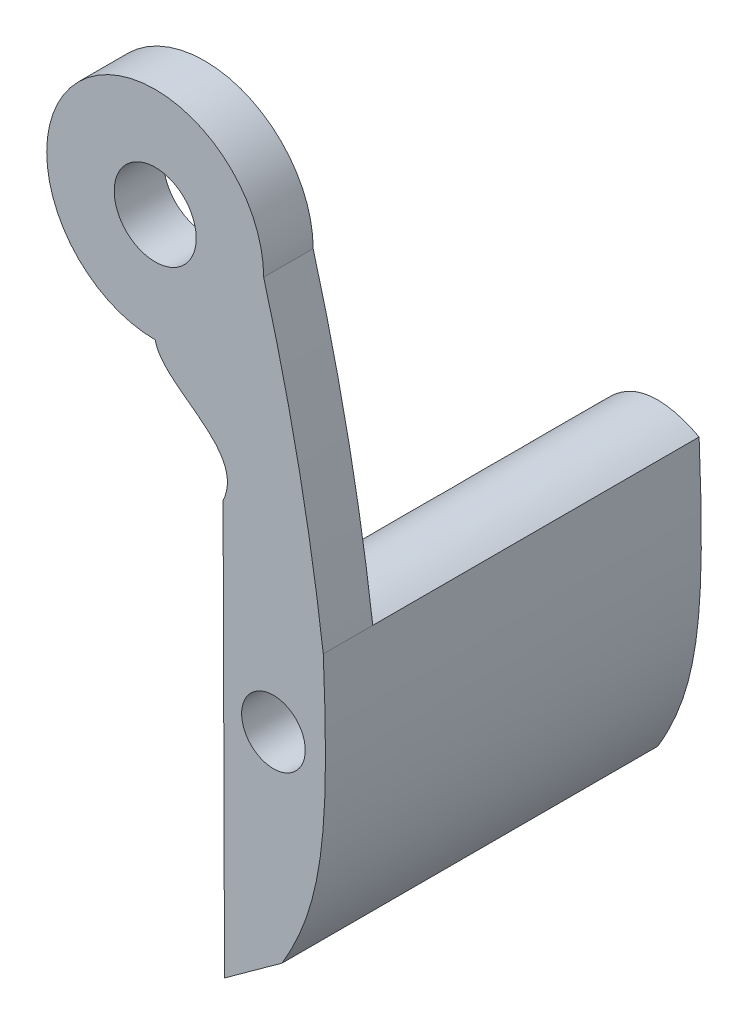
ISO-10303-21;
HEADER;
FILE_DESCRIPTION(('STEP AP214'),'2;1');
FILE_NAME('part.step','',(''),(''),'','','');
FILE_SCHEMA(('AUTOMOTIVE_DESIGN { 1 0 10303 214 1 1 1 1 }'));
ENDSEC;
DATA;
#1=APPLICATION_CONTEXT('core data for automotive mechanical design processes');
#2=APPLICATION_PROTOCOL_DEFINITION('international standard','automotive_design',2000,#1);
#3=PRODUCT_CONTEXT('',#1,'mechanical');
#4=PRODUCT('Part','Part','',(#3));
#5=PRODUCT_RELATED_PRODUCT_CATEGORY('part','',(#4));
#6=PRODUCT_DEFINITION_FORMATION('','',#4);
#7=PRODUCT_DEFINITION_CONTEXT('part definition',#1,'design');
#8=PRODUCT_DEFINITION('design','',#6,#7);
#9=PRODUCT_DEFINITION_SHAPE('','',#8);
#10=(LENGTH_UNIT() NAMED_UNIT(*) SI_UNIT(.MILLI.,.METRE.));
#11=(NAMED_UNIT(*) PLANE_ANGLE_UNIT() SI_UNIT($,.RADIAN.));
#12=(NAMED_UNIT(*) SI_UNIT($,.STERADIAN.) SOLID_ANGLE_UNIT());
#13=UNCERTAINTY_MEASURE_WITH_UNIT(LENGTH_MEASURE(1.E-05),#10,'distance_accuracy_value','');
#14=(GEOMETRIC_REPRESENTATION_CONTEXT(3) GLOBAL_UNCERTAINTY_ASSIGNED_CONTEXT((#13)) GLOBAL_UNIT_ASSIGNED_CONTEXT((#10,
#11,#12)) REPRESENTATION_CONTEXT('',''));
#15=CARTESIAN_POINT('',(0.,0.,0.));
#16=DIRECTION('',(0.,0.,1.));
#17=DIRECTION('',(1.,0.,0.));
#18=AXIS2_PLACEMENT_3D('',#15,#16,#17);
#19=CARTESIAN_POINT('',(23.5830831343586,-50.6621029570981,1.41873551586532));
#20=DIRECTION('',(-0.999993998212447,-0.00346461240021393,0.));
#21=DIRECTION('',(0.00346461240021393,-0.999993998212447,0.));
#22=AXIS2_PLACEMENT_3D('',#19,#20,#21);
#23=PLANE('',#22);
#24=DIRECTION('',(0.00346461240021393,-0.999993998212447,0.));
#25=VECTOR('',#24,1.);
#26=CARTESIAN_POINT('',(23.5830831343586,-50.6621029570981,4.91873551586532));
#27=LINE('',#26,#25);
#28=CARTESIAN_POINT('',(23.5830831343586,-50.6621029570981,4.91873551586532));
#29=VERTEX_POINT('',#28);
#30=CARTESIAN_POINT('',(23.6842225641709,-79.8540618581353,4.91873551586532));
#31=VERTEX_POINT('',#30);
#32=EDGE_CURVE('E143',#29,#31,#27,.T.);
#33=ORIENTED_EDGE('',*,*,#32,.F.);
#34=DIRECTION('',(0.,0.,1.));
#35=VECTOR('',#34,1.);
#36=CARTESIAN_POINT('',(23.5830831343586,-50.6621029570981,1.41873551586532));
#37=LINE('',#36,#35);
#38=CARTESIAN_POINT('',(23.5830831343586,-50.6621029570981,1.41873551586532));
#39=VERTEX_POINT('',#38);
#40=EDGE_CURVE('E11',#39,#29,#37,.T.);
#41=ORIENTED_EDGE('',*,*,#40,.F.);
#42=DIRECTION('',(0.00346461240020755,-0.999993998212447,0.));
#43=VECTOR('',#42,1.);
#44=CARTESIAN_POINT('',(23.6086615825674,-58.0448320297016,1.41873551586532));
#45=LINE('',#44,#43);
#46=CARTESIAN_POINT('',(23.6086615825711,-58.0448320307762,1.41873551586532));
#47=VERTEX_POINT('',#46);
#48=EDGE_CURVE('E59',#39,#47,#45,.T.);
#49=ORIENTED_EDGE('',*,*,#48,.T.);
#50=DIRECTION('',(0.,0.,1.));
#51=VECTOR('',#50,1.);
#52=CARTESIAN_POINT('',(23.6086615818498,-58.0448320307828,-21.6581314841347));
#53=LINE('',#52,#51);
#54=CARTESIAN_POINT('',(23.6086615818498,-58.0448320307828,-21.6581314841347));
#55=VERTEX_POINT('',#54);
#56=EDGE_CURVE('E112',#55,#47,#53,.T.);
#57=ORIENTED_EDGE('',*,*,#56,.F.);
#58=DIRECTION('',(-0.00346461240020755,0.999993998212447,0.));
#59=VECTOR('',#58,1.);
#60=CARTESIAN_POINT('',(23.6842225641709,-79.8540618581353,-21.6581314841347));
#61=LINE('',#60,#59);
#62=CARTESIAN_POINT('',(23.6842225641709,-79.8540618581353,-21.6581314841347));
#63=VERTEX_POINT('',#62);
#64=EDGE_CURVE('E119',#63,#55,#61,.T.);
#65=ORIENTED_EDGE('',*,*,#64,.F.);
#66=DIRECTION('',(0.,0.,1.));
#67=VECTOR('',#66,1.);
#68=CARTESIAN_POINT('',(23.6842225641709,-79.8540618581353,1.41873551586532));
#69=LINE('',#68,#67);
#70=EDGE_CURVE('E41',#63,#31,#69,.T.);
#71=ORIENTED_EDGE('',*,*,#70,.T.);
#72=EDGE_LOOP('',(#33,#41,#49,#57,#65,#71));
#73=FACE_BOUND('',#72,.T.);
#74=ADVANCED_FACE('F37',(#73),#23,.T.);
#75=CARTESIAN_POINT('',(18.7830331394305,-43.2252481779718,1.41873551586532));
#76=CARTESIAN_POINT('',(19.3227725840483,-45.8172283218555,1.41873551586532));
#77=CARTESIAN_POINT('',(25.294082338753,-46.9405897101704,1.41873551586532));
#78=CARTESIAN_POINT('',(23.5830831343586,-50.6621029570981,1.41873551586532));
#79=B_SPLINE_CURVE_WITH_KNOTS('',3,(#75,#76,#77,#78),.UNSPECIFIED.,.F.,.F.,(4,4),(0.,1.),.UNSPECIFIED.);
#80=DIRECTION('',(0.,0.,1.));
#81=VECTOR('',#80,1.);
#82=SURFACE_OF_LINEAR_EXTRUSION('',#79,#81);
#83=CARTESIAN_POINT('',(18.7830331394305,-43.2252481779718,4.91873551586532));
#84=CARTESIAN_POINT('',(19.3227725840483,-45.8172283218555,4.91873551586532));
#85=CARTESIAN_POINT('',(25.294082338753,-46.9405897101704,4.91873551586532));
#86=CARTESIAN_POINT('',(23.5830831343586,-50.6621029570981,4.91873551586532));
#87=B_SPLINE_CURVE_WITH_KNOTS('',3,(#83,#84,#85,#86),.UNSPECIFIED.,.F.,.F.,(4,4),(0.,1.),.UNSPECIFIED.);
#88=CARTESIAN_POINT('',(18.7830331394305,-43.2252481779718,4.91873551586532));
#89=VERTEX_POINT('',#88);
#90=EDGE_CURVE('E201',#89,#29,#87,.T.);
#91=ORIENTED_EDGE('',*,*,#90,.F.);
#92=DIRECTION('',(0.,0.,1.));
#93=VECTOR('',#92,1.);
#94=CARTESIAN_POINT('',(18.7830331394305,-43.2252481779718,1.41873551586532));
#95=LINE('',#94,#93);
#96=CARTESIAN_POINT('',(18.7830331394305,-43.2252481779718,1.41873551586532));
#97=VERTEX_POINT('',#96);
#98=EDGE_CURVE('E46',#97,#89,#95,.T.);
#99=ORIENTED_EDGE('',*,*,#98,.F.);
#100=EDGE_CURVE('E171',#97,#39,#79,.T.);
#101=ORIENTED_EDGE('',*,*,#100,.T.);
#102=ORIENTED_EDGE('',*,*,#40,.T.);
#103=EDGE_LOOP('',(#91,#99,#101,#102));
#104=FACE_BOUND('',#103,.T.);
#105=ADVANCED_FACE('F166',(#104),#82,.T.);
#106=CARTESIAN_POINT('',(18.7830331394305,-35.55478648582,1.41873551586532));
#107=DIRECTION('',(0.,0.,1.));
#108=DIRECTION('',(1.,0.,0.));
#109=AXIS2_PLACEMENT_3D('',#106,#107,#108);
#110=CYLINDRICAL_SURFACE('',#109,7.67046169215176);
#111=CARTESIAN_POINT('',(18.7830331394305,-35.55478648582,4.91873551586532));
#112=DIRECTION('',(0.,0.,1.));
#113=DIRECTION('',(1.,0.,0.));
#114=AXIS2_PLACEMENT_3D('',#111,#112,#113);
#115=CIRCLE('',#114,7.67046169215176);
#116=CARTESIAN_POINT('',(26.4534948315822,-35.55478648582,4.91873551586532));
#117=VERTEX_POINT('',#116);
#118=EDGE_CURVE('E195',#117,#89,#115,.T.);
#119=ORIENTED_EDGE('',*,*,#118,.F.);
#120=DIRECTION('',(0.,0.,1.));
#121=VECTOR('',#120,1.);
#122=CARTESIAN_POINT('',(26.4534948315822,-35.55478648582,1.41873551586532));
#123=LINE('',#122,#121);
#124=CARTESIAN_POINT('',(26.4534948315822,-35.55478648582,1.41873551586532));
#125=VERTEX_POINT('',#124);
#126=EDGE_CURVE('E90',#125,#117,#123,.T.);
#127=ORIENTED_EDGE('',*,*,#126,.F.);
#128=CARTESIAN_POINT('',(18.7830331394305,-35.55478648582,1.41873551586532));
#129=DIRECTION('',(0.,0.,1.));
#130=DIRECTION('',(1.,0.,0.));
#131=AXIS2_PLACEMENT_3D('',#128,#129,#130);
#132=CIRCLE('',#131,7.67046169215176);
#133=EDGE_CURVE('E176',#125,#97,#132,.T.);
#134=ORIENTED_EDGE('',*,*,#133,.T.);
#135=ORIENTED_EDGE('',*,*,#98,.T.);
#136=EDGE_LOOP('',(#119,#127,#134,#135));
#137=FACE_BOUND('',#136,.T.);
#138=ADVANCED_FACE('F162',(#137),#110,.T.);
#139=CARTESIAN_POINT('',(30.6680595779187,-56.5170898812196,1.41873551586532));
#140=CARTESIAN_POINT('',(29.3204289813708,-45.883744030394,1.41873551586532));
#141=CARTESIAN_POINT('',(26.4534948315822,-35.55478648582,1.41873551586532));
#142=B_SPLINE_CURVE_WITH_KNOTS('',2,(#139,#140,#141),.UNSPECIFIED.,.F.,.F.,(3,3),(0.,1.),.UNSPECIFIED.);
#143=DIRECTION('',(0.,0.,1.));
#144=VECTOR('',#143,1.);
#145=SURFACE_OF_LINEAR_EXTRUSION('',#142,#144);
#146=CARTESIAN_POINT('',(30.6680595779187,-56.5170898812196,4.91873551586532));
#147=CARTESIAN_POINT('',(29.3204289813708,-45.883744030394,4.91873551586532));
#148=CARTESIAN_POINT('',(26.4534948315822,-35.55478648582,4.91873551586532));
#149=B_SPLINE_CURVE_WITH_KNOTS('',2,(#146,#147,#148),.UNSPECIFIED.,.F.,.F.,(3,3),(0.,1.),.UNSPECIFIED.);
#150=CARTESIAN_POINT('',(30.6680595779187,-56.5170898812196,4.91873551586532));
#151=VERTEX_POINT('',#150);
#152=EDGE_CURVE('E187',#151,#117,#149,.T.);
#153=ORIENTED_EDGE('',*,*,#152,.F.);
#154=DIRECTION('',(0.,0.,1.));
#155=VECTOR('',#154,1.);
#156=CARTESIAN_POINT('',(30.6680595779187,-56.5170898812196,1.41873551586532));
#157=LINE('',#156,#155);
#158=CARTESIAN_POINT('',(30.668059577541,-56.5170898810181,1.41873551586532));
#159=VERTEX_POINT('',#158);
#160=EDGE_CURVE('E211',#159,#151,#157,.T.);
#161=ORIENTED_EDGE('',*,*,#160,.F.);
#162=EDGE_CURVE('E142',#159,#125,#142,.T.);
#163=ORIENTED_EDGE('',*,*,#162,.T.);
#164=ORIENTED_EDGE('',*,*,#126,.T.);
#165=EDGE_LOOP('',(#153,#161,#163,#164));
#166=FACE_BOUND('',#165,.T.);
#167=ADVANCED_FACE('F158',(#166),#145,.T.);
#168=CARTESIAN_POINT('',(27.7516650240297,-76.9116141942992,1.41873551586532));
#169=CARTESIAN_POINT('',(30.6656126513569,-71.9964375748199,1.41873551586532));
#170=CARTESIAN_POINT('',(31.1321794796414,-67.2565321556517,1.41873551586532));
#171=CARTESIAN_POINT('',(30.6680595779187,-56.5170898812196,1.41873551586532));
#172=B_SPLINE_CURVE_WITH_KNOTS('',3,(#168,#169,#170,#171),.UNSPECIFIED.,.F.,.F.,(4,4),
(0.222415534740242,0.766682964721302),.UNSPECIFIED.);
#173=DIRECTION('',(0.,0.,1.));
#174=VECTOR('',#173,1.);
#175=SURFACE_OF_LINEAR_EXTRUSION('',#172,#174);
#176=CARTESIAN_POINT('',(27.7516650240297,-76.9116141942992,4.91873551586532));
#177=CARTESIAN_POINT('',(30.6656126513569,-71.9964375748199,4.91873551586532));
#178=CARTESIAN_POINT('',(31.1321794796414,-67.2565321556517,4.91873551586532));
#179=CARTESIAN_POINT('',(30.6680595779187,-56.5170898812196,4.91873551586532));
#180=B_SPLINE_CURVE_WITH_KNOTS('',3,(#176,#177,#178,#179),.UNSPECIFIED.,.F.,.F.,(4,4),
(0.222415534740242,0.766682964721302),.UNSPECIFIED.);
#181=CARTESIAN_POINT('',(27.7516650240297,-76.9116141942992,4.91873551586532));
#182=VERTEX_POINT('',#181);
#183=EDGE_CURVE('E182',#182,#151,#180,.T.);
#184=ORIENTED_EDGE('',*,*,#183,.F.);
#185=DIRECTION('',(0.,0.,1.));
#186=VECTOR('',#185,1.);
#187=CARTESIAN_POINT('',(27.7516650240297,-76.9116141942992,1.41873551586532));
#188=LINE('',#187,#186);
#189=CARTESIAN_POINT('',(27.7516650240297,-76.9116141942992,-21.6581314841347));
#190=VERTEX_POINT('',#189);
#191=EDGE_CURVE('E212',#190,#182,#188,.T.);
#192=ORIENTED_EDGE('',*,*,#191,.F.);
#193=CARTESIAN_POINT('',(30.668059577541,-56.5170898810181,-21.6581314841347));
#194=CARTESIAN_POINT('',(31.1321794794735,-67.2565321554411,-21.6581314841347));
#195=CARTESIAN_POINT('',(30.6656126512816,-71.9964375746184,-21.6581314841347));
#196=CARTESIAN_POINT('',(27.7516650240504,-76.9116141941546,-21.6581314841347));
#197=B_SPLINE_CURVE_WITH_KNOTS('',3,(#193,#194,#195,#196),.UNSPECIFIED.,.F.,.F.,(4,4),
(0.222415534740242,0.766682964721302),.UNSPECIFIED.);
#198=CARTESIAN_POINT('',(30.668059577541,-56.5170898810181,-21.6581314841347));
#199=VERTEX_POINT('',#198);
#200=EDGE_CURVE('E118',#199,#190,#197,.T.);
#201=ORIENTED_EDGE('',*,*,#200,.F.);
#202=DIRECTION('',(0.,0.,1.));
#203=VECTOR('',#202,1.);
#204=CARTESIAN_POINT('',(30.668059577541,-56.5170898810181,-21.6581314841347));
#205=LINE('',#204,#203);
#206=EDGE_CURVE('E114',#199,#159,#205,.T.);
#207=ORIENTED_EDGE('',*,*,#206,.T.);
#208=ORIENTED_EDGE('',*,*,#160,.T.);
#209=EDGE_LOOP('',(#184,#192,#201,#207,#208));
#210=FACE_BOUND('',#209,.T.);
#211=ADVANCED_FACE('F155',(#210),#175,.T.);
#212=CARTESIAN_POINT('',(23.6842225641709,-79.8540618581353,1.41873551586532));
#213=DIRECTION('',(0.586125341437605,-0.810220392315974,0.));
#214=DIRECTION('',(0.810220392315974,0.586125341437605,0.));
#215=AXIS2_PLACEMENT_3D('',#212,#213,#214);
#216=PLANE('',#215);
#217=DIRECTION('',(0.810220392315974,0.586125341437605,0.));
#218=VECTOR('',#217,1.);
#219=CARTESIAN_POINT('',(23.6842225641709,-79.8540618581353,4.91873551586532));
#220=LINE('',#219,#218);
#221=EDGE_CURVE('E139',#31,#182,#220,.T.);
#222=ORIENTED_EDGE('',*,*,#221,.F.);
#223=ORIENTED_EDGE('',*,*,#70,.F.);
#224=DIRECTION('',(-0.810220392315974,-0.586125341437605,0.));
#225=VECTOR('',#224,1.);
#226=CARTESIAN_POINT('',(27.7516650240297,-76.9116141942992,-21.6581314841347));
#227=LINE('',#226,#225);
#228=EDGE_CURVE('E125',#190,#63,#227,.T.);
#229=ORIENTED_EDGE('',*,*,#228,.F.);
#230=ORIENTED_EDGE('',*,*,#191,.T.);
#231=EDGE_LOOP('',(#222,#223,#229,#230));
#232=FACE_BOUND('',#231,.T.);
#233=ADVANCED_FACE('F39',(#232),#216,.T.);
#234=CARTESIAN_POINT('',(30.4766376243679,-68.8984516583667,1.41873551586532));
#235=DIRECTION('',(0.,0.,-1.));
#236=DIRECTION('',(-1.,0.,0.));
#237=AXIS2_PLACEMENT_3D('',#234,#235,#236);
#238=PLANE('',#237);
#239=CARTESIAN_POINT('',(225947.817454841,-974205.853876003,1.41873551586532));
#240=CARTESIAN_POINT('',(-228752.664459082,973422.471229088,1.41873551586532));
#241=CARTESIAN_POINT('',(231664.383204436,-972862.390558936,1.41873551586532));
#242=B_SPLINE_CURVE_WITH_KNOTS('',2,(#239,#240,#241),.UNSPECIFIED.,.F.,.F.,(3,3),(0.,1.),.UNSPECIFIED.);
#243=EDGE_CURVE('E54',#47,#159,#242,.T.);
#244=ORIENTED_EDGE('',*,*,#243,.F.);
#245=ORIENTED_EDGE('',*,*,#48,.F.);
#246=ORIENTED_EDGE('',*,*,#100,.F.);
#247=ORIENTED_EDGE('',*,*,#133,.F.);
#248=ORIENTED_EDGE('',*,*,#162,.F.);
#249=EDGE_LOOP('',(#244,#245,#246,#247,#248));
#250=FACE_BOUND('',#249,.T.);
#251=CARTESIAN_POINT('',(18.7830331394305,-35.55478648582,1.41873551586532));
#252=DIRECTION('',(0.,0.,1.));
#253=DIRECTION('',(1.,0.,0.));
#254=AXIS2_PLACEMENT_3D('',#251,#252,#253);
#255=CIRCLE('',#254,2.9);
#256=CARTESIAN_POINT('',(21.6830331394305,-35.55478648582,1.41873551586532));
#257=VERTEX_POINT('',#256);
#258=EDGE_CURVE('E133',#257,#257,#255,.T.);
#259=ORIENTED_EDGE('',*,*,#258,.T.);
#260=EDGE_LOOP('',(#259));
#261=FACE_BOUND('',#260,.T.);
#262=ADVANCED_FACE('F218',(#250,#261),#238,.T.);
#263=CARTESIAN_POINT('',(30.4766376243679,-68.8984516583667,4.91873551586532));
#264=DIRECTION('',(0.,0.,-1.));
#265=DIRECTION('',(-1.,0.,0.));
#266=AXIS2_PLACEMENT_3D('',#263,#264,#265);
#267=PLANE('',#266);
#268=CARTESIAN_POINT('',(27.1437232414781,-63.0556717115034,4.91873551586532));
#269=DIRECTION('',(0.,0.,1.));
#270=DIRECTION('',(1.,0.,0.));
#271=AXIS2_PLACEMENT_3D('',#268,#269,#270);
#272=CIRCLE('',#271,2.25);
#273=CARTESIAN_POINT('',(29.3937232414781,-63.0556717115034,4.91873551586532));
#274=VERTEX_POINT('',#273);
#275=EDGE_CURVE('E376',#274,#274,#272,.T.);
#276=ORIENTED_EDGE('',*,*,#275,.F.);
#277=EDGE_LOOP('',(#276));
#278=FACE_BOUND('',#277,.T.);
#279=CARTESIAN_POINT('',(18.7830331394305,-35.55478648582,4.91873551586532));
#280=DIRECTION('',(0.,0.,1.));
#281=DIRECTION('',(1.,0.,0.));
#282=AXIS2_PLACEMENT_3D('',#279,#280,#281);
#283=CIRCLE('',#282,2.9);
#284=CARTESIAN_POINT('',(21.6830331394305,-35.55478648582,4.91873551586532));
#285=VERTEX_POINT('',#284);
#286=EDGE_CURVE('E130',#285,#285,#283,.T.);
#287=ORIENTED_EDGE('',*,*,#286,.F.);
#288=EDGE_LOOP('',(#287));
#289=FACE_BOUND('',#288,.T.);
#290=ORIENTED_EDGE('',*,*,#32,.T.);
#291=ORIENTED_EDGE('',*,*,#221,.T.);
#292=ORIENTED_EDGE('',*,*,#183,.T.);
#293=ORIENTED_EDGE('',*,*,#152,.T.);
#294=ORIENTED_EDGE('',*,*,#118,.T.);
#295=ORIENTED_EDGE('',*,*,#90,.T.);
#296=EDGE_LOOP('',(#290,#291,#292,#293,#294,#295));
#297=FACE_BOUND('',#296,.T.);
#298=ADVANCED_FACE('F217',(#278,#289,#297),#267,.F.);
#299=CARTESIAN_POINT('',(18.7830331394305,-35.55478648582,1.41873551586532));
#300=DIRECTION('',(0.,0.,1.));
#301=DIRECTION('',(1.,0.,0.));
#302=AXIS2_PLACEMENT_3D('',#299,#300,#301);
#303=CYLINDRICAL_SURFACE('',#302,2.9);
#304=ORIENTED_EDGE('',*,*,#258,.F.);
#305=EDGE_LOOP('',(#304));
#306=FACE_BOUND('',#305,.T.);
#307=ORIENTED_EDGE('',*,*,#286,.T.);
#308=EDGE_LOOP('',(#307));
#309=FACE_BOUND('',#308,.T.);
#310=ADVANCED_FACE('F247',(#306,#309),#303,.F.);
#311=CARTESIAN_POINT('',(225947.817454841,-974205.853876003,-21.6581314841347));
#312=CARTESIAN_POINT('',(-228752.664459082,973422.471229088,-21.6581314841347));
#313=CARTESIAN_POINT('',(231664.383204436,-972862.390558936,-21.6581314841347));
#314=B_SPLINE_CURVE_WITH_KNOTS('',2,(#311,#312,#313),.UNSPECIFIED.,.F.,.F.,(3,3),(0.,1.),.UNSPECIFIED.);
#315=DIRECTION('',(0.,0.,1.));
#316=VECTOR('',#315,1.);
#317=SURFACE_OF_LINEAR_EXTRUSION('',#314,#316);
#318=ORIENTED_EDGE('',*,*,#243,.T.);
#319=ORIENTED_EDGE('',*,*,#206,.F.);
#320=EDGE_CURVE('E108',#55,#199,#314,.T.);
#321=ORIENTED_EDGE('',*,*,#320,.F.);
#322=ORIENTED_EDGE('',*,*,#56,.T.);
#323=EDGE_LOOP('',(#318,#319,#321,#322));
#324=FACE_BOUND('',#323,.T.);
#325=ADVANCED_FACE('F110',(#324),#317,.F.);
#326=CARTESIAN_POINT('',(26.7179352781568,-55.8254941907421,-21.6581314841347));
#327=DIRECTION('',(0.,0.,1.));
#328=DIRECTION('',(1.,0.,0.));
#329=AXIS2_PLACEMENT_3D('',#326,#327,#328);
#330=PLANE('',#329);
#331=CARTESIAN_POINT('',(27.1437232414781,-63.0556717115034,-21.6581314841347));
#332=DIRECTION('',(0.,0.,1.));
#333=DIRECTION('',(1.,0.,0.));
#334=AXIS2_PLACEMENT_3D('',#331,#332,#333);
#335=CIRCLE('',#334,2.25);
#336=CARTESIAN_POINT('',(29.3937232414781,-63.0556717115034,-21.6581314841347));
#337=VERTEX_POINT('',#336);
#338=EDGE_CURVE('E223',#337,#337,#335,.T.);
#339=ORIENTED_EDGE('',*,*,#338,.T.);
#340=EDGE_LOOP('',(#339));
#341=FACE_BOUND('',#340,.T.);
#342=ORIENTED_EDGE('',*,*,#64,.T.);
#343=ORIENTED_EDGE('',*,*,#320,.T.);
#344=ORIENTED_EDGE('',*,*,#200,.T.);
#345=ORIENTED_EDGE('',*,*,#228,.T.);
#346=EDGE_LOOP('',(#342,#343,#344,#345));
#347=FACE_BOUND('',#346,.T.);
#348=ADVANCED_FACE('F123',(#341,#347),#330,.F.);
#349=CARTESIAN_POINT('',(27.1437232414781,-63.0556717115034,-21.6581314841347));
#350=DIRECTION('',(0.,0.,1.));
#351=DIRECTION('',(1.,0.,0.));
#352=AXIS2_PLACEMENT_3D('',#349,#350,#351);
#353=CYLINDRICAL_SURFACE('',#352,2.25);
#354=ORIENTED_EDGE('',*,*,#338,.F.);
#355=EDGE_LOOP('',(#354));
#356=FACE_BOUND('',#355,.T.);
#357=ORIENTED_EDGE('',*,*,#275,.T.);
#358=EDGE_LOOP('',(#357));
#359=FACE_BOUND('',#358,.T.);
#360=ADVANCED_FACE('F312',(#356,#359),#353,.F.);
#361=CLOSED_SHELL('',(#74,#105,#138,#167,#211,#233,#262,#298,#310,#325,#348,#360));
#362=MANIFOLD_SOLID_BREP('B2',#361);
#363=ADVANCED_BREP_SHAPE_REPRESENTATION('',(#18,#362),#14);
#364=SHAPE_DEFINITION_REPRESENTATION(#9,#363);
ENDSEC;
END-ISO-10303-21;
